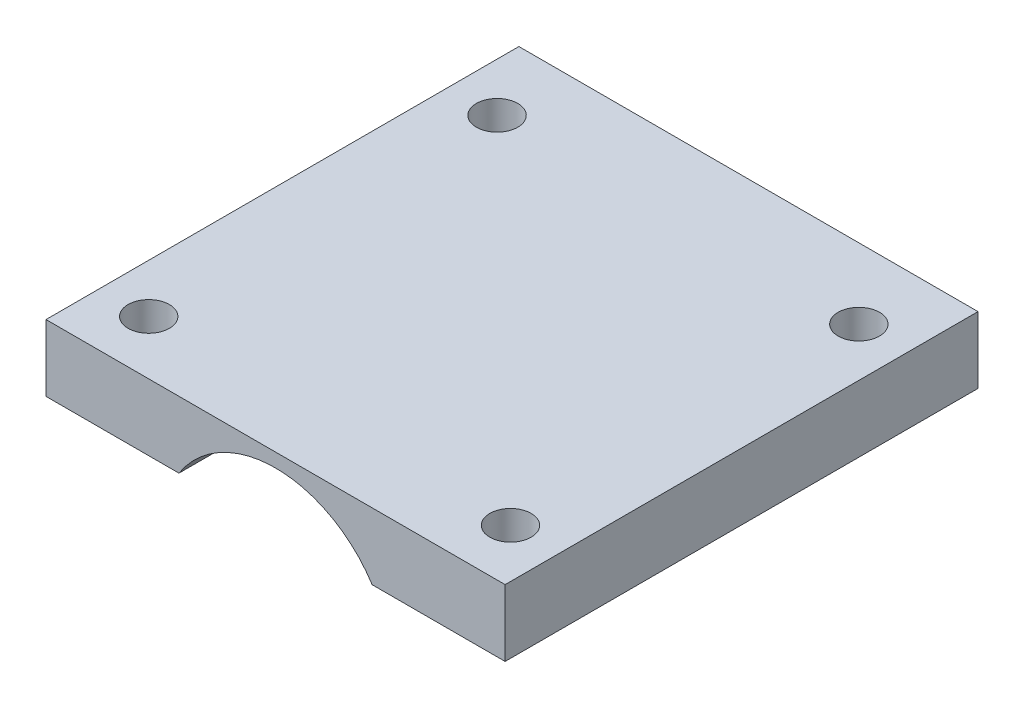
ISO-10303-21;
HEADER;
FILE_DESCRIPTION(('STEP AP214'),'2;1');
FILE_NAME('part.step','',(''),(''),'','','');
FILE_SCHEMA(('AUTOMOTIVE_DESIGN { 1 0 10303 214 1 1 1 1 }'));
ENDSEC;
DATA;
#1=APPLICATION_CONTEXT('core data for automotive mechanical design processes');
#2=APPLICATION_PROTOCOL_DEFINITION('international standard','automotive_design',2000,#1);
#3=PRODUCT_CONTEXT('',#1,'mechanical');
#4=PRODUCT('Part','Part','',(#3));
#5=PRODUCT_RELATED_PRODUCT_CATEGORY('part','',(#4));
#6=PRODUCT_DEFINITION_FORMATION('','',#4);
#7=PRODUCT_DEFINITION_CONTEXT('part definition',#1,'design');
#8=PRODUCT_DEFINITION('design','',#6,#7);
#9=PRODUCT_DEFINITION_SHAPE('','',#8);
#10=(LENGTH_UNIT() NAMED_UNIT(*) SI_UNIT(.MILLI.,.METRE.));
#11=(NAMED_UNIT(*) PLANE_ANGLE_UNIT() SI_UNIT($,.RADIAN.));
#12=(NAMED_UNIT(*) SI_UNIT($,.STERADIAN.) SOLID_ANGLE_UNIT());
#13=UNCERTAINTY_MEASURE_WITH_UNIT(LENGTH_MEASURE(1.E-05),#10,'distance_accuracy_value','');
#14=(GEOMETRIC_REPRESENTATION_CONTEXT(3) GLOBAL_UNCERTAINTY_ASSIGNED_CONTEXT((#13)) GLOBAL_UNIT_ASSIGNED_CONTEXT((#10,
#11,#12)) REPRESENTATION_CONTEXT('',''));
#15=CARTESIAN_POINT('',(0.,0.,0.));
#16=DIRECTION('',(0.,0.,1.));
#17=DIRECTION('',(1.,0.,0.));
#18=AXIS2_PLACEMENT_3D('',#15,#16,#17);
#19=CARTESIAN_POINT('',(0.,6.75,0.));
#20=DIRECTION('',(0.,1.,0.));
#21=DIRECTION('',(0.,0.,1.));
#22=AXIS2_PLACEMENT_3D('',#19,#20,#21);
#23=PLANE('',#22);
#24=CARTESIAN_POINT('',(-19.6986749407734,6.75,44.1150104980837));
#25=DIRECTION('',(0.,1.,0.));
#26=DIRECTION('',(0.,0.,1.));
#27=AXIS2_PLACEMENT_3D('',#24,#25,#26);
#28=CIRCLE('',#27,2.25);
#29=CARTESIAN_POINT('',(-19.6986749407734,6.75,46.3650104980837));
#30=VERTEX_POINT('',#29);
#31=EDGE_CURVE('E161',#30,#30,#28,.F.);
#32=ORIENTED_EDGE('',*,*,#31,.F.);
#33=EDGE_LOOP('',(#32));
#34=FACE_BOUND('',#33,.T.);
#35=CARTESIAN_POINT('',(19.6986749407734,6.75,6.17682172326088));
#36=DIRECTION('',(0.,1.,0.));
#37=DIRECTION('',(0.,0.,1.));
#38=AXIS2_PLACEMENT_3D('',#35,#36,#37);
#39=CIRCLE('',#38,2.25);
#40=CARTESIAN_POINT('',(19.6986749407734,6.75,8.42682172326087));
#41=VERTEX_POINT('',#40);
#42=EDGE_CURVE('E146',#41,#41,#39,.F.);
#43=ORIENTED_EDGE('',*,*,#42,.F.);
#44=EDGE_LOOP('',(#43));
#45=FACE_BOUND('',#44,.T.);
#46=DIRECTION('',(-1.,0.,0.));
#47=VECTOR('',#46,1.);
#48=CARTESIAN_POINT('',(0.,6.75,0.));
#49=LINE('',#48,#47);
#50=CARTESIAN_POINT('',(10.5208127062504,6.75,0.));
#51=VERTEX_POINT('',#50);
#52=CARTESIAN_POINT('',(-10.5208127062504,6.75,0.));
#53=VERTEX_POINT('',#52);
#54=EDGE_CURVE('E11',#51,#53,#49,.T.);
#55=ORIENTED_EDGE('',*,*,#54,.T.);
#56=DIRECTION('',(0.,0.,-1.));
#57=VECTOR('',#56,1.);
#58=CARTESIAN_POINT('',(-10.5208127062504,6.75,50.));
#59=LINE('',#58,#57);
#60=CARTESIAN_POINT('',(-10.5208127062504,6.75,50.));
#61=VERTEX_POINT('',#60);
#62=EDGE_CURVE('E62',#53,#61,#59,.F.);
#63=ORIENTED_EDGE('',*,*,#62,.T.);
#64=DIRECTION('',(-1.,0.,0.));
#65=VECTOR('',#64,1.);
#66=CARTESIAN_POINT('',(0.,6.75,50.));
#67=LINE('',#66,#65);
#68=CARTESIAN_POINT('',(-25.,6.75,50.));
#69=VERTEX_POINT('',#68);
#70=EDGE_CURVE('E47',#61,#69,#67,.T.);
#71=ORIENTED_EDGE('',*,*,#70,.T.);
#72=DIRECTION('',(0.,0.,-1.));
#73=VECTOR('',#72,1.);
#74=CARTESIAN_POINT('',(-25.,6.75,50.));
#75=LINE('',#74,#73);
#76=CARTESIAN_POINT('',(-25.,6.75,-1.5));
#77=VERTEX_POINT('',#76);
#78=EDGE_CURVE('E150',#69,#77,#75,.T.);
#79=ORIENTED_EDGE('',*,*,#78,.T.);
#80=DIRECTION('',(-1.,0.,0.));
#81=VECTOR('',#80,1.);
#82=CARTESIAN_POINT('',(0.,6.75,-1.5));
#83=LINE('',#82,#81);
#84=CARTESIAN_POINT('',(25.,6.75,-1.5));
#85=VERTEX_POINT('',#84);
#86=EDGE_CURVE('E102',#85,#77,#83,.T.);
#87=ORIENTED_EDGE('',*,*,#86,.F.);
#88=DIRECTION('',(0.,0.,1.));
#89=VECTOR('',#88,1.);
#90=CARTESIAN_POINT('',(25.,6.75,50.));
#91=LINE('',#90,#89);
#92=CARTESIAN_POINT('',(25.,6.75,50.));
#93=VERTEX_POINT('',#92);
#94=EDGE_CURVE('E147',#85,#93,#91,.T.);
#95=ORIENTED_EDGE('',*,*,#94,.T.);
#96=CARTESIAN_POINT('',(10.5208127062504,6.75,50.));
#97=VERTEX_POINT('',#96);
#98=EDGE_CURVE('E154',#93,#97,#67,.T.);
#99=ORIENTED_EDGE('',*,*,#98,.T.);
#100=DIRECTION('',(0.,0.,-1.));
#101=VECTOR('',#100,1.);
#102=CARTESIAN_POINT('',(10.5208127062504,6.75,50.));
#103=LINE('',#102,#101);
#104=EDGE_CURVE('E54',#97,#51,#103,.T.);
#105=ORIENTED_EDGE('',*,*,#104,.T.);
#106=EDGE_LOOP('',(#55,#63,#71,#79,#87,#95,#99,#105));
#107=FACE_BOUND('',#106,.T.);
#108=CARTESIAN_POINT('',(-19.6986749407734,6.75,6.17682172326088));
#109=DIRECTION('',(0.,1.,0.));
#110=DIRECTION('',(0.,0.,1.));
#111=AXIS2_PLACEMENT_3D('',#108,#109,#110);
#112=CIRCLE('',#111,2.25);
#113=CARTESIAN_POINT('',(-19.6986749407734,6.75,8.42682172326087));
#114=VERTEX_POINT('',#113);
#115=EDGE_CURVE('E159',#114,#114,#112,.F.);
#116=ORIENTED_EDGE('',*,*,#115,.F.);
#117=EDGE_LOOP('',(#116));
#118=FACE_BOUND('',#117,.T.);
#119=CARTESIAN_POINT('',(19.6986749407734,6.75,44.1150104980837));
#120=DIRECTION('',(0.,1.,0.));
#121=DIRECTION('',(0.,0.,1.));
#122=AXIS2_PLACEMENT_3D('',#119,#120,#121);
#123=CIRCLE('',#122,2.25);
#124=CARTESIAN_POINT('',(19.6986749407734,6.75,46.3650104980837));
#125=VERTEX_POINT('',#124);
#126=EDGE_CURVE('E42',#125,#125,#123,.F.);
#127=ORIENTED_EDGE('',*,*,#126,.F.);
#128=EDGE_LOOP('',(#127));
#129=FACE_BOUND('',#128,.T.);
#130=ADVANCED_FACE('F39',(#34,#45,#107,#118,#129),#23,.F.);
#131=CARTESIAN_POINT('',(0.,0.,50.));
#132=DIRECTION('',(0.,0.,-1.));
#133=DIRECTION('',(-1.,0.,0.));
#134=AXIS2_PLACEMENT_3D('',#131,#132,#133);
#135=CYLINDRICAL_SURFACE('',#134,12.5);
#136=ORIENTED_EDGE('',*,*,#104,.F.);
#137=CARTESIAN_POINT('',(0.,0.,50.));
#138=DIRECTION('',(0.,0.,1.));
#139=DIRECTION('',(1.,0.,0.));
#140=AXIS2_PLACEMENT_3D('',#137,#138,#139);
#141=CIRCLE('',#140,12.5);
#142=EDGE_CURVE('E140',#97,#61,#141,.T.);
#143=ORIENTED_EDGE('',*,*,#142,.T.);
#144=ORIENTED_EDGE('',*,*,#62,.F.);
#145=CARTESIAN_POINT('',(0.,0.,0.));
#146=DIRECTION('',(0.,0.,1.));
#147=DIRECTION('',(1.,0.,0.));
#148=AXIS2_PLACEMENT_3D('',#145,#146,#147);
#149=CIRCLE('',#148,12.5);
#150=EDGE_CURVE('E133',#51,#53,#149,.T.);
#151=ORIENTED_EDGE('',*,*,#150,.F.);
#152=EDGE_LOOP('',(#136,#143,#144,#151));
#153=FACE_BOUND('',#152,.T.);
#154=ADVANCED_FACE('F172',(#153),#135,.F.);
#155=CARTESIAN_POINT('',(0.,0.,0.));
#156=DIRECTION('',(0.,0.,1.));
#157=DIRECTION('',(1.,0.,0.));
#158=AXIS2_PLACEMENT_3D('',#155,#156,#157);
#159=PLANE('',#158);
#160=ORIENTED_EDGE('',*,*,#54,.F.);
#161=ORIENTED_EDGE('',*,*,#150,.T.);
#162=EDGE_LOOP('',(#160,#161));
#163=FACE_BOUND('',#162,.T.);
#164=ADVANCED_FACE('F178',(#163),#159,.T.);
#165=CARTESIAN_POINT('',(0.,14.,50.));
#166=DIRECTION('',(0.,1.,0.));
#167=DIRECTION('',(0.,0.,1.));
#168=AXIS2_PLACEMENT_3D('',#165,#166,#167);
#169=PLANE('',#168);
#170=CARTESIAN_POINT('',(19.6986749407734,14.,6.17682172326088));
#171=DIRECTION('',(0.,-1.,0.));
#172=DIRECTION('',(0.,0.,-1.));
#173=AXIS2_PLACEMENT_3D('',#170,#171,#172);
#174=CIRCLE('',#173,2.24999999999999);
#175=CARTESIAN_POINT('',(19.6986749407734,14.,3.92682172326089));
#176=VERTEX_POINT('',#175);
#177=EDGE_CURVE('E118',#176,#176,#174,.T.);
#178=ORIENTED_EDGE('',*,*,#177,.T.);
#179=EDGE_LOOP('',(#178));
#180=FACE_BOUND('',#179,.T.);
#181=CARTESIAN_POINT('',(-19.6986749407734,14.,6.17682172326088));
#182=DIRECTION('',(0.,-1.,0.));
#183=DIRECTION('',(0.,0.,-1.));
#184=AXIS2_PLACEMENT_3D('',#181,#182,#183);
#185=CIRCLE('',#184,2.24999999999999);
#186=CARTESIAN_POINT('',(-19.6986749407734,14.,3.92682172326089));
#187=VERTEX_POINT('',#186);
#188=EDGE_CURVE('E121',#187,#187,#185,.T.);
#189=ORIENTED_EDGE('',*,*,#188,.T.);
#190=EDGE_LOOP('',(#189));
#191=FACE_BOUND('',#190,.T.);
#192=CARTESIAN_POINT('',(-19.6986749407734,14.,44.1150104980837));
#193=DIRECTION('',(0.,-1.,0.));
#194=DIRECTION('',(0.,0.,-1.));
#195=AXIS2_PLACEMENT_3D('',#192,#193,#194);
#196=CIRCLE('',#195,2.24999999999999);
#197=CARTESIAN_POINT('',(-19.6986749407734,14.,41.8650104980837));
#198=VERTEX_POINT('',#197);
#199=EDGE_CURVE('E127',#198,#198,#196,.T.);
#200=ORIENTED_EDGE('',*,*,#199,.T.);
#201=EDGE_LOOP('',(#200));
#202=FACE_BOUND('',#201,.T.);
#203=CARTESIAN_POINT('',(19.6986749407734,14.,44.1150104980837));
#204=DIRECTION('',(0.,-1.,0.));
#205=DIRECTION('',(0.,0.,-1.));
#206=AXIS2_PLACEMENT_3D('',#203,#204,#205);
#207=CIRCLE('',#206,2.24999999999999);
#208=CARTESIAN_POINT('',(19.6986749407734,14.,41.8650104980837));
#209=VERTEX_POINT('',#208);
#210=EDGE_CURVE('E130',#209,#209,#207,.T.);
#211=ORIENTED_EDGE('',*,*,#210,.T.);
#212=EDGE_LOOP('',(#211));
#213=FACE_BOUND('',#212,.T.);
#214=DIRECTION('',(0.,0.,-1.));
#215=VECTOR('',#214,1.);
#216=CARTESIAN_POINT('',(25.,14.,50.));
#217=LINE('',#216,#215);
#218=CARTESIAN_POINT('',(25.,14.,50.));
#219=VERTEX_POINT('',#218);
#220=CARTESIAN_POINT('',(25.,14.,-1.5));
#221=VERTEX_POINT('',#220);
#222=EDGE_CURVE('E115',#219,#221,#217,.T.);
#223=ORIENTED_EDGE('',*,*,#222,.T.);
#224=DIRECTION('',(1.,0.,0.));
#225=VECTOR('',#224,1.);
#226=CARTESIAN_POINT('',(25.,14.,-1.5));
#227=LINE('',#226,#225);
#228=CARTESIAN_POINT('',(-25.,14.,-1.5));
#229=VERTEX_POINT('',#228);
#230=EDGE_CURVE('E99',#229,#221,#227,.T.);
#231=ORIENTED_EDGE('',*,*,#230,.F.);
#232=DIRECTION('',(0.,0.,-1.));
#233=VECTOR('',#232,1.);
#234=CARTESIAN_POINT('',(-25.,14.,50.));
#235=LINE('',#234,#233);
#236=CARTESIAN_POINT('',(-25.,14.,50.));
#237=VERTEX_POINT('',#236);
#238=EDGE_CURVE('E108',#237,#229,#235,.T.);
#239=ORIENTED_EDGE('',*,*,#238,.F.);
#240=DIRECTION('',(1.,0.,0.));
#241=VECTOR('',#240,1.);
#242=CARTESIAN_POINT('',(0.,14.,50.));
#243=LINE('',#242,#241);
#244=EDGE_CURVE('E134',#237,#219,#243,.T.);
#245=ORIENTED_EDGE('',*,*,#244,.T.);
#246=EDGE_LOOP('',(#223,#231,#239,#245));
#247=FACE_BOUND('',#246,.T.);
#248=ADVANCED_FACE('F117',(#180,#191,#202,#213,#247),#169,.T.);
#249=CARTESIAN_POINT('',(-25.,0.,50.));
#250=DIRECTION('',(-1.,0.,0.));
#251=DIRECTION('',(0.,0.,1.));
#252=AXIS2_PLACEMENT_3D('',#249,#250,#251);
#253=PLANE('',#252);
#254=ORIENTED_EDGE('',*,*,#78,.F.);
#255=DIRECTION('',(0.,1.,0.));
#256=VECTOR('',#255,1.);
#257=CARTESIAN_POINT('',(-25.,0.,50.));
#258=LINE('',#257,#256);
#259=EDGE_CURVE('E111',#69,#237,#258,.T.);
#260=ORIENTED_EDGE('',*,*,#259,.T.);
#261=ORIENTED_EDGE('',*,*,#238,.T.);
#262=DIRECTION('',(0.,1.,0.));
#263=VECTOR('',#262,1.);
#264=CARTESIAN_POINT('',(-25.,14.,-1.5));
#265=LINE('',#264,#263);
#266=EDGE_CURVE('E94',#77,#229,#265,.T.);
#267=ORIENTED_EDGE('',*,*,#266,.F.);
#268=EDGE_LOOP('',(#254,#260,#261,#267));
#269=FACE_BOUND('',#268,.T.);
#270=ADVANCED_FACE('F109',(#269),#253,.T.);
#271=CARTESIAN_POINT('',(25.,0.,50.));
#272=DIRECTION('',(1.,0.,0.));
#273=DIRECTION('',(0.,1.,0.));
#274=AXIS2_PLACEMENT_3D('',#271,#272,#273);
#275=PLANE('',#274);
#276=ORIENTED_EDGE('',*,*,#94,.F.);
#277=DIRECTION('',(0.,-1.,0.));
#278=VECTOR('',#277,1.);
#279=CARTESIAN_POINT('',(25.,-0.499999999999995,-1.5));
#280=LINE('',#279,#278);
#281=EDGE_CURVE('E105',#221,#85,#280,.T.);
#282=ORIENTED_EDGE('',*,*,#281,.F.);
#283=ORIENTED_EDGE('',*,*,#222,.F.);
#284=DIRECTION('',(0.,-1.,0.));
#285=VECTOR('',#284,1.);
#286=CARTESIAN_POINT('',(25.,0.,50.));
#287=LINE('',#286,#285);
#288=EDGE_CURVE('E137',#219,#93,#287,.T.);
#289=ORIENTED_EDGE('',*,*,#288,.T.);
#290=EDGE_LOOP('',(#276,#282,#283,#289));
#291=FACE_BOUND('',#290,.T.);
#292=ADVANCED_FACE('F191',(#291),#275,.T.);
#293=CARTESIAN_POINT('',(0.,0.,-1.5));
#294=DIRECTION('',(0.,0.,1.));
#295=DIRECTION('',(1.,0.,0.));
#296=AXIS2_PLACEMENT_3D('',#293,#294,#295);
#297=PLANE('',#296);
#298=ORIENTED_EDGE('',*,*,#281,.T.);
#299=ORIENTED_EDGE('',*,*,#86,.T.);
#300=ORIENTED_EDGE('',*,*,#266,.T.);
#301=ORIENTED_EDGE('',*,*,#230,.T.);
#302=EDGE_LOOP('',(#298,#299,#300,#301));
#303=FACE_BOUND('',#302,.T.);
#304=ADVANCED_FACE('F97',(#303),#297,.F.);
#305=CARTESIAN_POINT('',(19.6986749407734,-15.,6.17682172326088));
#306=DIRECTION('',(0.,-1.,0.));
#307=DIRECTION('',(0.,0.,-1.));
#308=AXIS2_PLACEMENT_3D('',#305,#306,#307);
#309=CYLINDRICAL_SURFACE('',#308,2.25);
#310=ORIENTED_EDGE('',*,*,#42,.T.);
#311=EDGE_LOOP('',(#310));
#312=FACE_BOUND('',#311,.T.);
#313=ORIENTED_EDGE('',*,*,#177,.F.);
#314=EDGE_LOOP('',(#313));
#315=FACE_BOUND('',#314,.T.);
#316=ADVANCED_FACE('F216',(#312,#315),#309,.F.);
#317=CARTESIAN_POINT('',(-19.6986749407734,-15.,6.17682172326088));
#318=DIRECTION('',(0.,-1.,0.));
#319=DIRECTION('',(0.,0.,-1.));
#320=AXIS2_PLACEMENT_3D('',#317,#318,#319);
#321=CYLINDRICAL_SURFACE('',#320,2.25);
#322=ORIENTED_EDGE('',*,*,#115,.T.);
#323=EDGE_LOOP('',(#322));
#324=FACE_BOUND('',#323,.T.);
#325=ORIENTED_EDGE('',*,*,#188,.F.);
#326=EDGE_LOOP('',(#325));
#327=FACE_BOUND('',#326,.T.);
#328=ADVANCED_FACE('F212',(#324,#327),#321,.F.);
#329=CARTESIAN_POINT('',(-19.6986749407734,-15.,44.1150104980837));
#330=DIRECTION('',(0.,-1.,0.));
#331=DIRECTION('',(0.,0.,-1.));
#332=AXIS2_PLACEMENT_3D('',#329,#330,#331);
#333=CYLINDRICAL_SURFACE('',#332,2.25);
#334=ORIENTED_EDGE('',*,*,#31,.T.);
#335=EDGE_LOOP('',(#334));
#336=FACE_BOUND('',#335,.T.);
#337=ORIENTED_EDGE('',*,*,#199,.F.);
#338=EDGE_LOOP('',(#337));
#339=FACE_BOUND('',#338,.T.);
#340=ADVANCED_FACE('F187',(#336,#339),#333,.F.);
#341=CARTESIAN_POINT('',(19.6986749407734,-15.,44.1150104980837));
#342=DIRECTION('',(0.,-1.,0.));
#343=DIRECTION('',(0.,0.,-1.));
#344=AXIS2_PLACEMENT_3D('',#341,#342,#343);
#345=CYLINDRICAL_SURFACE('',#344,2.25);
#346=ORIENTED_EDGE('',*,*,#126,.T.);
#347=EDGE_LOOP('',(#346));
#348=FACE_BOUND('',#347,.T.);
#349=ORIENTED_EDGE('',*,*,#210,.F.);
#350=EDGE_LOOP('',(#349));
#351=FACE_BOUND('',#350,.T.);
#352=ADVANCED_FACE('F168',(#348,#351),#345,.F.);
#353=CARTESIAN_POINT('',(0.,0.,50.));
#354=DIRECTION('',(0.,0.,1.));
#355=DIRECTION('',(1.,0.,0.));
#356=AXIS2_PLACEMENT_3D('',#353,#354,#355);
#357=PLANE('',#356);
#358=ORIENTED_EDGE('',*,*,#98,.F.);
#359=ORIENTED_EDGE('',*,*,#288,.F.);
#360=ORIENTED_EDGE('',*,*,#244,.F.);
#361=ORIENTED_EDGE('',*,*,#259,.F.);
#362=ORIENTED_EDGE('',*,*,#70,.F.);
#363=ORIENTED_EDGE('',*,*,#142,.F.);
#364=EDGE_LOOP('',(#358,#359,#360,#361,#362,#363));
#365=FACE_BOUND('',#364,.T.);
#366=ADVANCED_FACE('F174',(#365),#357,.T.);
#367=CLOSED_SHELL('',(#130,#154,#164,#248,#270,#292,#304,#316,#328,#340,#352,#366));
#368=MANIFOLD_SOLID_BREP('B2',#367);
#369=ADVANCED_BREP_SHAPE_REPRESENTATION('',(#18,#368),#14);
#370=SHAPE_DEFINITION_REPRESENTATION(#9,#369);
ENDSEC;
END-ISO-10303-21;
